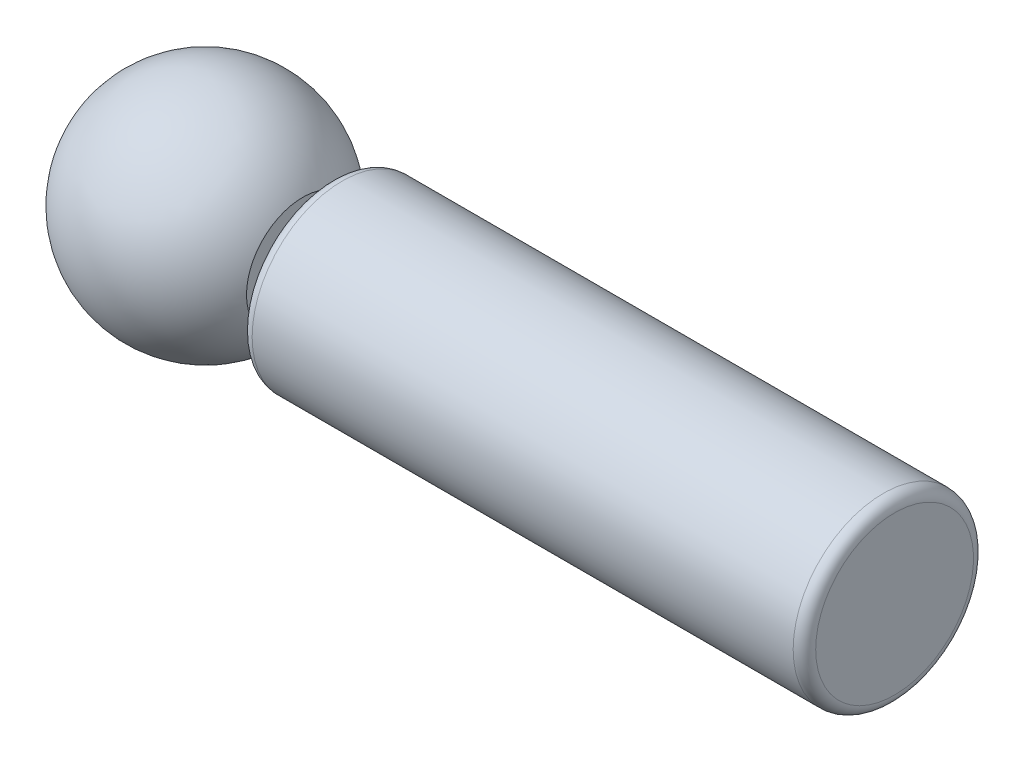
ISO-10303-21;
HEADER;
FILE_DESCRIPTION(('STEP AP214'),'2;1');
FILE_NAME('part.step','',(''),(''),'','','');
FILE_SCHEMA(('AUTOMOTIVE_DESIGN { 1 0 10303 214 1 1 1 1 }'));
ENDSEC;
DATA;
#1=APPLICATION_CONTEXT('core data for automotive mechanical design processes');
#2=APPLICATION_PROTOCOL_DEFINITION('international standard','automotive_design',2000,#1);
#3=PRODUCT_CONTEXT('',#1,'mechanical');
#4=PRODUCT('Part','Part','',(#3));
#5=PRODUCT_RELATED_PRODUCT_CATEGORY('part','',(#4));
#6=PRODUCT_DEFINITION_FORMATION('','',#4);
#7=PRODUCT_DEFINITION_CONTEXT('part definition',#1,'design');
#8=PRODUCT_DEFINITION('design','',#6,#7);
#9=PRODUCT_DEFINITION_SHAPE('','',#8);
#10=(LENGTH_UNIT() NAMED_UNIT(*) SI_UNIT(.MILLI.,.METRE.));
#11=(NAMED_UNIT(*) PLANE_ANGLE_UNIT() SI_UNIT($,.RADIAN.));
#12=(NAMED_UNIT(*) SI_UNIT($,.STERADIAN.) SOLID_ANGLE_UNIT());
#13=UNCERTAINTY_MEASURE_WITH_UNIT(LENGTH_MEASURE(1.E-05),#10,'distance_accuracy_value','');
#14=(GEOMETRIC_REPRESENTATION_CONTEXT(3) GLOBAL_UNCERTAINTY_ASSIGNED_CONTEXT((#13)) GLOBAL_UNIT_ASSIGNED_CONTEXT((#10,
#11,#12)) REPRESENTATION_CONTEXT('',''));
#15=CARTESIAN_POINT('',(0.,0.,0.));
#16=DIRECTION('',(0.,0.,1.));
#17=DIRECTION('',(1.,0.,0.));
#18=AXIS2_PLACEMENT_3D('',#15,#16,#17);
#19=CARTESIAN_POINT('',(61.1602540378444,0.,0.));
#20=DIRECTION('',(-1.,0.,0.));
#21=DIRECTION('',(0.,0.,1.));
#22=AXIS2_PLACEMENT_3D('',#19,#20,#21);
#23=PLANE('',#22);
#24=CARTESIAN_POINT('',(61.1602540378444,0.,0.));
#25=DIRECTION('',(-1.,0.,0.));
#26=DIRECTION('',(0.,0.,1.));
#27=AXIS2_PLACEMENT_3D('',#24,#25,#26);
#28=CIRCLE('',#27,7.);
#29=CARTESIAN_POINT('',(61.1602540378444,0.,7.));
#30=VERTEX_POINT('',#29);
#31=EDGE_CURVE('E10',#30,#30,#28,.F.);
#32=ORIENTED_EDGE('',*,*,#31,.T.);
#33=EDGE_LOOP('',(#32));
#34=FACE_BOUND('',#33,.T.);
#35=ADVANCED_FACE('F37',(#34),#23,.F.);
#36=CARTESIAN_POINT('',(0.,0.,0.));
#37=DIRECTION('',(-1.,0.,0.));
#38=DIRECTION('',(0.,0.,1.));
#39=AXIS2_PLACEMENT_3D('',#36,#37,#38);
#40=SPHERICAL_SURFACE('',#39,10.);
#41=CARTESIAN_POINT('',(8.66025403784439,0.,0.));
#42=DIRECTION('',(-1.,0.,0.));
#43=DIRECTION('',(0.,0.,1.));
#44=AXIS2_PLACEMENT_3D('',#41,#42,#43);
#45=CIRCLE('',#44,5.);
#46=CARTESIAN_POINT('',(8.66025403784439,0.,5.));
#47=VERTEX_POINT('',#46);
#48=EDGE_CURVE('E57',#47,#47,#45,.T.);
#49=ORIENTED_EDGE('',*,*,#48,.T.);
#50=EDGE_LOOP('',(#49));
#51=FACE_BOUND('',#50,.T.);
#52=ADVANCED_FACE('F90',(#51),#40,.T.);
#53=CARTESIAN_POINT('',(8.66025403784439,0.,-5.));
#54=DIRECTION('',(1.,0.,0.));
#55=DIRECTION('',(0.,0.,-1.));
#56=AXIS2_PLACEMENT_3D('',#53,#54,#55);
#57=PLANE('',#56);
#58=CARTESIAN_POINT('',(8.66025403784439,0.,0.));
#59=DIRECTION('',(-1.,0.,0.));
#60=DIRECTION('',(0.,0.,1.));
#61=AXIS2_PLACEMENT_3D('',#58,#59,#60);
#62=CIRCLE('',#61,3.5);
#63=CARTESIAN_POINT('',(8.66025403784439,0.,3.5));
#64=VERTEX_POINT('',#63);
#65=EDGE_CURVE('E60',#64,#64,#62,.T.);
#66=ORIENTED_EDGE('',*,*,#65,.T.);
#67=EDGE_LOOP('',(#66));
#68=FACE_BOUND('',#67,.T.);
#69=ORIENTED_EDGE('',*,*,#48,.F.);
#70=EDGE_LOOP('',(#69));
#71=FACE_BOUND('',#70,.T.);
#72=ADVANCED_FACE('F95',(#68,#71),#57,.T.);
#73=CARTESIAN_POINT('',(9.41025403784439,0.,0.));
#74=DIRECTION('',(-1.,0.,0.));
#75=DIRECTION('',(0.,0.,1.));
#76=AXIS2_PLACEMENT_3D('',#73,#74,#75);
#77=TOROIDAL_SURFACE('',#76,3.5,0.75);
#78=ORIENTED_EDGE('',*,*,#65,.F.);
#79=EDGE_LOOP('',(#78));
#80=FACE_BOUND('',#79,.T.);
#81=CARTESIAN_POINT('',(9.41025403784439,0.,0.));
#82=DIRECTION('',(-1.,0.,0.));
#83=DIRECTION('',(0.,0.,1.));
#84=AXIS2_PLACEMENT_3D('',#81,#82,#83);
#85=CIRCLE('',#84,2.75);
#86=CARTESIAN_POINT('',(9.41025403784439,0.,2.75));
#87=VERTEX_POINT('',#86);
#88=EDGE_CURVE('E63',#87,#87,#85,.T.);
#89=ORIENTED_EDGE('',*,*,#88,.T.);
#90=EDGE_LOOP('',(#89));
#91=FACE_BOUND('',#90,.T.);
#92=ADVANCED_FACE('F142',(#80,#91),#77,.F.);
#93=CARTESIAN_POINT('',(0.,0.,0.));
#94=DIRECTION('',(-1.,0.,0.));
#95=DIRECTION('',(0.,0.,1.));
#96=AXIS2_PLACEMENT_3D('',#93,#94,#95);
#97=CYLINDRICAL_SURFACE('',#96,2.75);
#98=ORIENTED_EDGE('',*,*,#88,.F.);
#99=EDGE_LOOP('',(#98));
#100=FACE_BOUND('',#99,.T.);
#101=CARTESIAN_POINT('',(10.4102540378444,0.,0.));
#102=DIRECTION('',(-1.,0.,0.));
#103=DIRECTION('',(0.,0.,1.));
#104=AXIS2_PLACEMENT_3D('',#101,#102,#103);
#105=CIRCLE('',#104,2.75);
#106=CARTESIAN_POINT('',(10.4102540378444,0.,2.75));
#107=VERTEX_POINT('',#106);
#108=EDGE_CURVE('E66',#107,#107,#105,.T.);
#109=ORIENTED_EDGE('',*,*,#108,.T.);
#110=EDGE_LOOP('',(#109));
#111=FACE_BOUND('',#110,.T.);
#112=ADVANCED_FACE('F87',(#100,#111),#97,.T.);
#113=CARTESIAN_POINT('',(10.4102540378444,0.,0.));
#114=DIRECTION('',(-1.,0.,0.));
#115=DIRECTION('',(0.,0.,1.));
#116=AXIS2_PLACEMENT_3D('',#113,#114,#115);
#117=TOROIDAL_SURFACE('',#116,3.5,0.75);
#118=ORIENTED_EDGE('',*,*,#108,.F.);
#119=EDGE_LOOP('',(#118));
#120=FACE_BOUND('',#119,.T.);
#121=CARTESIAN_POINT('',(11.1602540378444,0.,0.));
#122=DIRECTION('',(-1.,0.,0.));
#123=DIRECTION('',(0.,0.,1.));
#124=AXIS2_PLACEMENT_3D('',#121,#122,#123);
#125=CIRCLE('',#124,3.5);
#126=CARTESIAN_POINT('',(11.1602540378444,0.,3.5));
#127=VERTEX_POINT('',#126);
#128=EDGE_CURVE('E69',#127,#127,#125,.T.);
#129=ORIENTED_EDGE('',*,*,#128,.T.);
#130=EDGE_LOOP('',(#129));
#131=FACE_BOUND('',#130,.T.);
#132=ADVANCED_FACE('F73',(#120,#131),#117,.F.);
#133=CARTESIAN_POINT('',(11.1602540378444,0.,-3.5));
#134=DIRECTION('',(-1.,0.,0.));
#135=DIRECTION('',(0.,0.,1.));
#136=AXIS2_PLACEMENT_3D('',#133,#134,#135);
#137=PLANE('',#136);
#138=CARTESIAN_POINT('',(11.1602540378444,0.,0.));
#139=DIRECTION('',(-1.,0.,0.));
#140=DIRECTION('',(0.,0.,1.));
#141=AXIS2_PLACEMENT_3D('',#138,#139,#140);
#142=CIRCLE('',#141,7.);
#143=CARTESIAN_POINT('',(11.1602540378444,0.,7.));
#144=VERTEX_POINT('',#143);
#145=EDGE_CURVE('E52',#144,#144,#142,.T.);
#146=ORIENTED_EDGE('',*,*,#145,.T.);
#147=EDGE_LOOP('',(#146));
#148=FACE_BOUND('',#147,.T.);
#149=ORIENTED_EDGE('',*,*,#128,.F.);
#150=EDGE_LOOP('',(#149));
#151=FACE_BOUND('',#150,.T.);
#152=ADVANCED_FACE('F75',(#148,#151),#137,.T.);
#153=CARTESIAN_POINT('',(0.,0.,0.));
#154=DIRECTION('',(-1.,0.,0.));
#155=DIRECTION('',(0.,0.,1.));
#156=AXIS2_PLACEMENT_3D('',#153,#154,#155);
#157=CYLINDRICAL_SURFACE('',#156,8.);
#158=CARTESIAN_POINT('',(12.1602540378444,0.,0.));
#159=DIRECTION('',(-1.,0.,0.));
#160=DIRECTION('',(0.,0.,1.));
#161=AXIS2_PLACEMENT_3D('',#158,#159,#160);
#162=CIRCLE('',#161,8.);
#163=CARTESIAN_POINT('',(12.1602540378444,0.,8.));
#164=VERTEX_POINT('',#163);
#165=EDGE_CURVE('E44',#164,#164,#162,.F.);
#166=ORIENTED_EDGE('',*,*,#165,.T.);
#167=EDGE_LOOP('',(#166));
#168=FACE_BOUND('',#167,.T.);
#169=CARTESIAN_POINT('',(60.1602540378444,0.,0.));
#170=DIRECTION('',(-1.,0.,0.));
#171=DIRECTION('',(0.,0.,1.));
#172=AXIS2_PLACEMENT_3D('',#169,#170,#171);
#173=CIRCLE('',#172,8.);
#174=CARTESIAN_POINT('',(60.1602540378444,0.,8.));
#175=VERTEX_POINT('',#174);
#176=EDGE_CURVE('E48',#175,#175,#173,.T.);
#177=ORIENTED_EDGE('',*,*,#176,.T.);
#178=EDGE_LOOP('',(#177));
#179=FACE_BOUND('',#178,.T.);
#180=ADVANCED_FACE('F77',(#168,#179),#157,.T.);
#181=CARTESIAN_POINT('',(12.1602540378444,0.,0.));
#182=DIRECTION('',(-1.,0.,0.));
#183=DIRECTION('',(0.,0.,1.));
#184=AXIS2_PLACEMENT_3D('',#181,#182,#183);
#185=TOROIDAL_SURFACE('',#184,7.,1.);
#186=ORIENTED_EDGE('',*,*,#165,.F.);
#187=EDGE_LOOP('',(#186));
#188=FACE_BOUND('',#187,.T.);
#189=ORIENTED_EDGE('',*,*,#145,.F.);
#190=EDGE_LOOP('',(#189));
#191=FACE_BOUND('',#190,.T.);
#192=ADVANCED_FACE('F84',(#188,#191),#185,.T.);
#193=CARTESIAN_POINT('',(60.1602540378444,0.,0.));
#194=DIRECTION('',(-1.,0.,0.));
#195=DIRECTION('',(0.,0.,1.));
#196=AXIS2_PLACEMENT_3D('',#193,#194,#195);
#197=TOROIDAL_SURFACE('',#196,7.,1.);
#198=ORIENTED_EDGE('',*,*,#31,.F.);
#199=EDGE_LOOP('',(#198));
#200=FACE_BOUND('',#199,.T.);
#201=ORIENTED_EDGE('',*,*,#176,.F.);
#202=EDGE_LOOP('',(#201));
#203=FACE_BOUND('',#202,.T.);
#204=ADVANCED_FACE('F39',(#200,#203),#197,.T.);
#205=CLOSED_SHELL('',(#35,#52,#72,#92,#112,#132,#152,#180,#192,#204));
#206=MANIFOLD_SOLID_BREP('B2',#205);
#207=ADVANCED_BREP_SHAPE_REPRESENTATION('',(#18,#206),#14);
#208=SHAPE_DEFINITION_REPRESENTATION(#9,#207);
ENDSEC;
END-ISO-10303-21;
